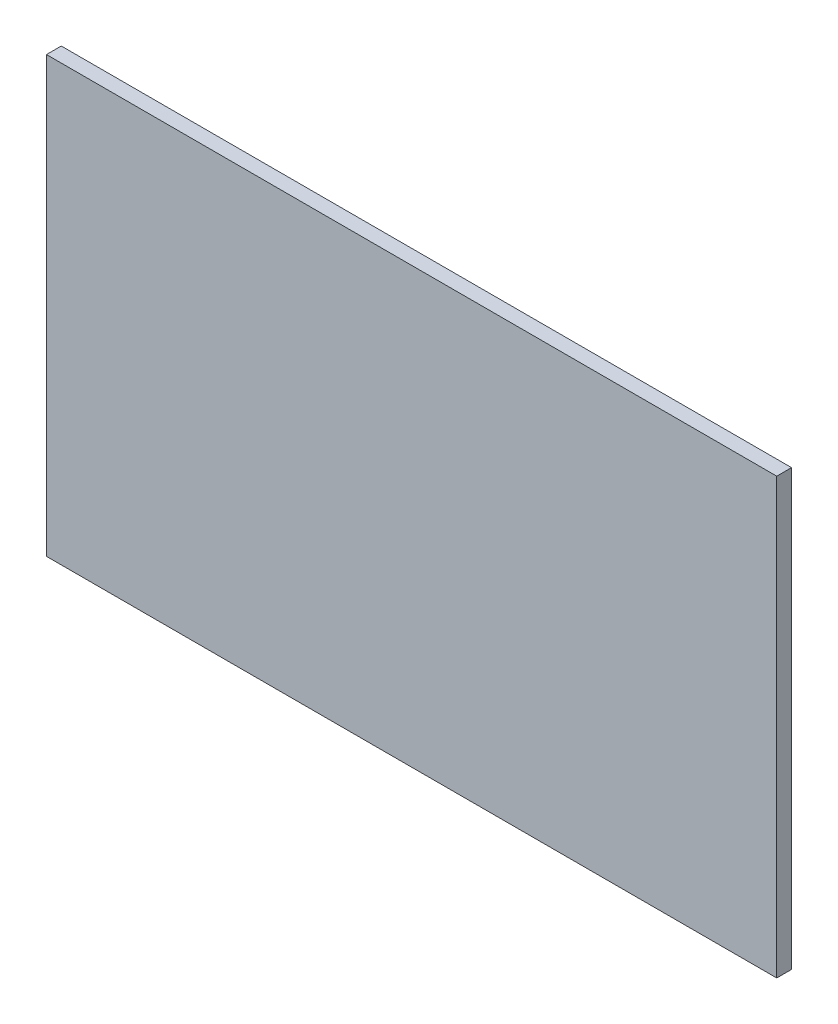
ISO-10303-21;
HEADER;
FILE_DESCRIPTION(('STEP AP214'),'2;1');
FILE_NAME('part.step','',(''),(''),'','','');
FILE_SCHEMA(('AUTOMOTIVE_DESIGN { 1 0 10303 214 1 1 1 1 }'));
ENDSEC;
DATA;
#1=APPLICATION_CONTEXT('core data for automotive mechanical design processes');
#2=APPLICATION_PROTOCOL_DEFINITION('international standard','automotive_design',2000,#1);
#3=PRODUCT_CONTEXT('',#1,'mechanical');
#4=PRODUCT('Part','Part','',(#3));
#5=PRODUCT_RELATED_PRODUCT_CATEGORY('part','',(#4));
#6=PRODUCT_DEFINITION_FORMATION('','',#4);
#7=PRODUCT_DEFINITION_CONTEXT('part definition',#1,'design');
#8=PRODUCT_DEFINITION('design','',#6,#7);
#9=PRODUCT_DEFINITION_SHAPE('','',#8);
#10=(LENGTH_UNIT() NAMED_UNIT(*) SI_UNIT(.MILLI.,.METRE.));
#11=(NAMED_UNIT(*) PLANE_ANGLE_UNIT() SI_UNIT($,.RADIAN.));
#12=(NAMED_UNIT(*) SI_UNIT($,.STERADIAN.) SOLID_ANGLE_UNIT());
#13=UNCERTAINTY_MEASURE_WITH_UNIT(LENGTH_MEASURE(1.E-05),#10,'distance_accuracy_value','');
#14=(GEOMETRIC_REPRESENTATION_CONTEXT(3) GLOBAL_UNCERTAINTY_ASSIGNED_CONTEXT((#13)) GLOBAL_UNIT_ASSIGNED_CONTEXT((#10,
#11,#12)) REPRESENTATION_CONTEXT('',''));
#15=CARTESIAN_POINT('',(0.,0.,0.));
#16=DIRECTION('',(0.,0.,1.));
#17=DIRECTION('',(1.,0.,0.));
#18=AXIS2_PLACEMENT_3D('',#15,#16,#17);
#19=CARTESIAN_POINT('',(0.,0.95,0.5));
#20=DIRECTION('',(0.,0.,1.));
#21=DIRECTION('',(1.,0.,0.));
#22=AXIS2_PLACEMENT_3D('',#19,#20,#21);
#23=PLANE('',#22);
#24=DIRECTION('',(0.,1.,0.));
#25=VECTOR('',#24,1.);
#26=CARTESIAN_POINT('',(-12.35,-6.4,0.5));
#27=LINE('',#26,#25);
#28=CARTESIAN_POINT('',(-12.35,-6.4,0.5));
#29=VERTEX_POINT('',#28);
#30=CARTESIAN_POINT('',(-12.35,8.3,0.5));
#31=VERTEX_POINT('',#30);
#32=EDGE_CURVE('E20',#29,#31,#27,.T.);
#33=ORIENTED_EDGE('',*,*,#32,.F.);
#34=DIRECTION('',(-1.,0.,0.));
#35=VECTOR('',#34,1.);
#36=CARTESIAN_POINT('',(12.35,-6.4,0.5));
#37=LINE('',#36,#35);
#38=CARTESIAN_POINT('',(12.35,-6.4,0.5));
#39=VERTEX_POINT('',#38);
#40=EDGE_CURVE('E65',#39,#29,#37,.T.);
#41=ORIENTED_EDGE('',*,*,#40,.F.);
#42=DIRECTION('',(0.,-1.,0.));
#43=VECTOR('',#42,1.);
#44=CARTESIAN_POINT('',(12.35,8.3,0.5));
#45=LINE('',#44,#43);
#46=CARTESIAN_POINT('',(12.35,8.3,0.5));
#47=VERTEX_POINT('',#46);
#48=EDGE_CURVE('E95',#47,#39,#45,.T.);
#49=ORIENTED_EDGE('',*,*,#48,.F.);
#50=DIRECTION('',(1.,0.,0.));
#51=VECTOR('',#50,1.);
#52=CARTESIAN_POINT('',(-12.35,8.3,0.5));
#53=LINE('',#52,#51);
#54=EDGE_CURVE('E92',#31,#47,#53,.T.);
#55=ORIENTED_EDGE('',*,*,#54,.F.);
#56=EDGE_LOOP('',(#33,#41,#49,#55));
#57=FACE_BOUND('',#56,.T.);
#58=ADVANCED_FACE('F17',(#57),#23,.T.);
#59=CARTESIAN_POINT('',(0.,0.95,0.));
#60=DIRECTION('',(0.,0.,1.));
#61=DIRECTION('',(1.,0.,0.));
#62=AXIS2_PLACEMENT_3D('',#59,#60,#61);
#63=PLANE('',#62);
#64=DIRECTION('',(1.,0.,0.));
#65=VECTOR('',#64,1.);
#66=CARTESIAN_POINT('',(-12.35,8.3,0.));
#67=LINE('',#66,#65);
#68=CARTESIAN_POINT('',(-12.35,8.3,0.));
#69=VERTEX_POINT('',#68);
#70=CARTESIAN_POINT('',(12.35,8.3,0.));
#71=VERTEX_POINT('',#70);
#72=EDGE_CURVE('E87',#69,#71,#67,.T.);
#73=ORIENTED_EDGE('',*,*,#72,.T.);
#74=DIRECTION('',(0.,-1.,0.));
#75=VECTOR('',#74,1.);
#76=CARTESIAN_POINT('',(12.35,8.3,0.));
#77=LINE('',#76,#75);
#78=CARTESIAN_POINT('',(12.35,-6.4,0.));
#79=VERTEX_POINT('',#78);
#80=EDGE_CURVE('E74',#71,#79,#77,.T.);
#81=ORIENTED_EDGE('',*,*,#80,.T.);
#82=DIRECTION('',(-1.,0.,0.));
#83=VECTOR('',#82,1.);
#84=CARTESIAN_POINT('',(12.35,-6.4,0.));
#85=LINE('',#84,#83);
#86=CARTESIAN_POINT('',(-12.35,-6.4,0.));
#87=VERTEX_POINT('',#86);
#88=EDGE_CURVE('E114',#79,#87,#85,.T.);
#89=ORIENTED_EDGE('',*,*,#88,.T.);
#90=DIRECTION('',(0.,1.,0.));
#91=VECTOR('',#90,1.);
#92=CARTESIAN_POINT('',(-12.35,-6.4,0.));
#93=LINE('',#92,#91);
#94=EDGE_CURVE('E11',#87,#69,#93,.T.);
#95=ORIENTED_EDGE('',*,*,#94,.T.);
#96=EDGE_LOOP('',(#73,#81,#89,#95));
#97=FACE_BOUND('',#96,.T.);
#98=ADVANCED_FACE('F86',(#97),#63,.F.);
#99=CARTESIAN_POINT('',(-12.35,-6.4,0.));
#100=DIRECTION('',(-1.,0.,0.));
#101=DIRECTION('',(0.,0.,1.));
#102=AXIS2_PLACEMENT_3D('',#99,#100,#101);
#103=PLANE('',#102);
#104=DIRECTION('',(0.,0.,1.));
#105=VECTOR('',#104,1.);
#106=CARTESIAN_POINT('',(-12.35,-6.4,0.));
#107=LINE('',#106,#105);
#108=EDGE_CURVE('E112',#87,#29,#107,.T.);
#109=ORIENTED_EDGE('',*,*,#108,.T.);
#110=ORIENTED_EDGE('',*,*,#32,.T.);
#111=DIRECTION('',(0.,0.,1.));
#112=VECTOR('',#111,1.);
#113=CARTESIAN_POINT('',(-12.35,8.3,0.));
#114=LINE('',#113,#112);
#115=EDGE_CURVE('E105',#69,#31,#114,.T.);
#116=ORIENTED_EDGE('',*,*,#115,.F.);
#117=ORIENTED_EDGE('',*,*,#94,.F.);
#118=EDGE_LOOP('',(#109,#110,#116,#117));
#119=FACE_BOUND('',#118,.T.);
#120=ADVANCED_FACE('F121',(#119),#103,.T.);
#121=CARTESIAN_POINT('',(12.35,-6.4,0.));
#122=DIRECTION('',(0.,-1.,0.));
#123=DIRECTION('',(0.,0.,-1.));
#124=AXIS2_PLACEMENT_3D('',#121,#122,#123);
#125=PLANE('',#124);
#126=DIRECTION('',(0.,0.,1.));
#127=VECTOR('',#126,1.);
#128=CARTESIAN_POINT('',(12.35,-6.4,0.));
#129=LINE('',#128,#127);
#130=EDGE_CURVE('E85',#79,#39,#129,.T.);
#131=ORIENTED_EDGE('',*,*,#130,.T.);
#132=ORIENTED_EDGE('',*,*,#40,.T.);
#133=ORIENTED_EDGE('',*,*,#108,.F.);
#134=ORIENTED_EDGE('',*,*,#88,.F.);
#135=EDGE_LOOP('',(#131,#132,#133,#134));
#136=FACE_BOUND('',#135,.T.);
#137=ADVANCED_FACE('F166',(#136),#125,.T.);
#138=CARTESIAN_POINT('',(12.35,8.3,0.));
#139=DIRECTION('',(1.,0.,0.));
#140=DIRECTION('',(0.,1.,0.));
#141=AXIS2_PLACEMENT_3D('',#138,#139,#140);
#142=PLANE('',#141);
#143=DIRECTION('',(0.,0.,1.));
#144=VECTOR('',#143,1.);
#145=CARTESIAN_POINT('',(12.35,8.3,0.));
#146=LINE('',#145,#144);
#147=EDGE_CURVE('E79',#71,#47,#146,.T.);
#148=ORIENTED_EDGE('',*,*,#147,.T.);
#149=ORIENTED_EDGE('',*,*,#48,.T.);
#150=ORIENTED_EDGE('',*,*,#130,.F.);
#151=ORIENTED_EDGE('',*,*,#80,.F.);
#152=EDGE_LOOP('',(#148,#149,#150,#151));
#153=FACE_BOUND('',#152,.T.);
#154=ADVANCED_FACE('F80',(#153),#142,.T.);
#155=CARTESIAN_POINT('',(-12.35,8.3,0.));
#156=DIRECTION('',(0.,1.,0.));
#157=DIRECTION('',(1.,0.,0.));
#158=AXIS2_PLACEMENT_3D('',#155,#156,#157);
#159=PLANE('',#158);
#160=ORIENTED_EDGE('',*,*,#115,.T.);
#161=ORIENTED_EDGE('',*,*,#54,.T.);
#162=ORIENTED_EDGE('',*,*,#147,.F.);
#163=ORIENTED_EDGE('',*,*,#72,.F.);
#164=EDGE_LOOP('',(#160,#161,#162,#163));
#165=FACE_BOUND('',#164,.T.);
#166=ADVANCED_FACE('F94',(#165),#159,.T.);
#167=CLOSED_SHELL('',(#58,#98,#120,#137,#154,#166));
#168=MANIFOLD_SOLID_BREP('B1',#167);
#169=ADVANCED_BREP_SHAPE_REPRESENTATION('',(#18,#168),#14);
#170=SHAPE_DEFINITION_REPRESENTATION(#9,#169);
ENDSEC;
END-ISO-10303-21;
